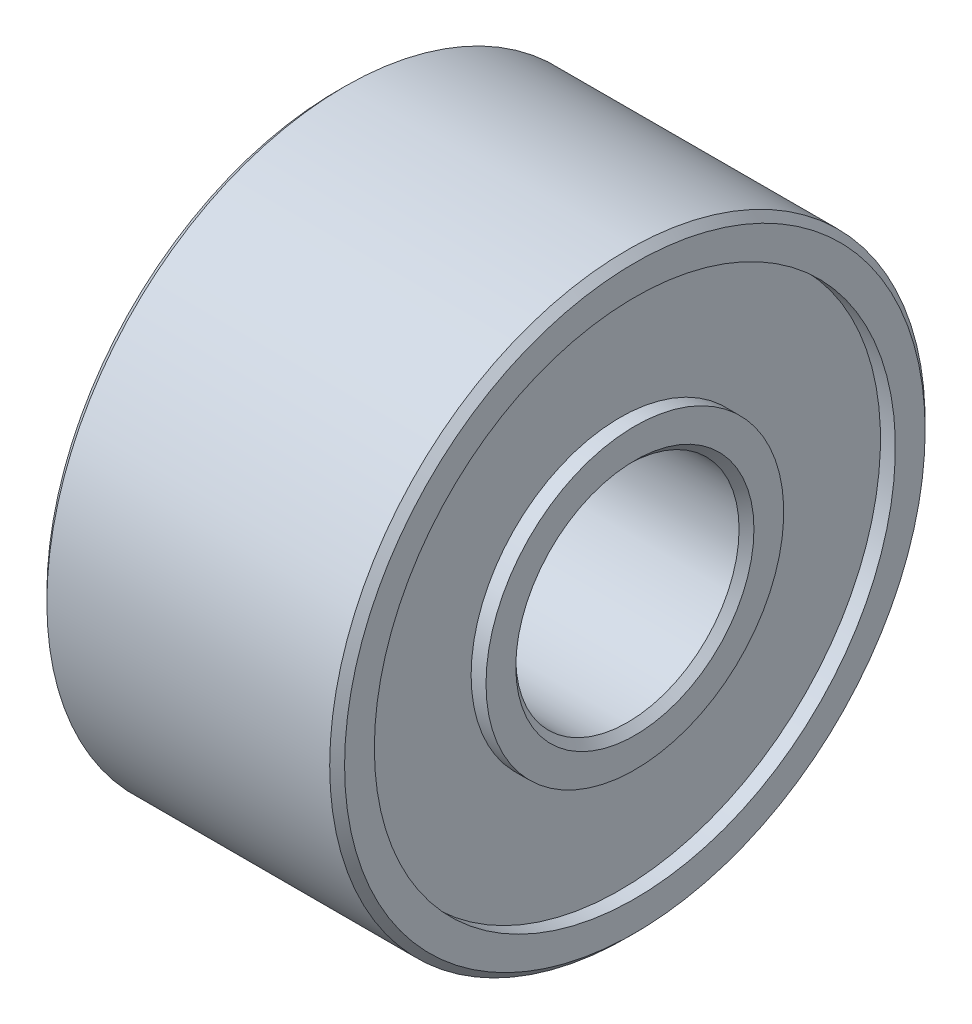
ISO-10303-21;
HEADER;
FILE_DESCRIPTION(('STEP AP214'),'2;1');
FILE_NAME('part.step','',(''),(''),'','','');
FILE_SCHEMA(('AUTOMOTIVE_DESIGN { 1 0 10303 214 1 1 1 1 }'));
ENDSEC;
DATA;
#1=APPLICATION_CONTEXT('core data for automotive mechanical design processes');
#2=APPLICATION_PROTOCOL_DEFINITION('international standard','automotive_design',2000,#1);
#3=PRODUCT_CONTEXT('',#1,'mechanical');
#4=PRODUCT('Part','Part','',(#3));
#5=PRODUCT_RELATED_PRODUCT_CATEGORY('part','',(#4));
#6=PRODUCT_DEFINITION_FORMATION('','',#4);
#7=PRODUCT_DEFINITION_CONTEXT('part definition',#1,'design');
#8=PRODUCT_DEFINITION('design','',#6,#7);
#9=PRODUCT_DEFINITION_SHAPE('','',#8);
#10=(LENGTH_UNIT() NAMED_UNIT(*) SI_UNIT(.MILLI.,.METRE.));
#11=(NAMED_UNIT(*) PLANE_ANGLE_UNIT() SI_UNIT($,.RADIAN.));
#12=(NAMED_UNIT(*) SI_UNIT($,.STERADIAN.) SOLID_ANGLE_UNIT());
#13=UNCERTAINTY_MEASURE_WITH_UNIT(LENGTH_MEASURE(1.E-05),#10,'distance_accuracy_value','');
#14=(GEOMETRIC_REPRESENTATION_CONTEXT(3) GLOBAL_UNCERTAINTY_ASSIGNED_CONTEXT((#13)) GLOBAL_UNIT_ASSIGNED_CONTEXT((#10,
#11,#12)) REPRESENTATION_CONTEXT('',''));
#15=CARTESIAN_POINT('',(0.,0.,0.));
#16=DIRECTION('',(0.,0.,1.));
#17=DIRECTION('',(1.,0.,0.));
#18=AXIS2_PLACEMENT_3D('',#15,#16,#17);
#19=CARTESIAN_POINT('',(-16.4448673667726,0.,0.));
#20=DIRECTION('',(-1.,0.,0.));
#21=DIRECTION('',(0.,0.,1.));
#22=AXIS2_PLACEMENT_3D('',#19,#20,#21);
#23=CYLINDRICAL_SURFACE('',#22,1.5);
#24=CARTESIAN_POINT('',(-3.9,0.,0.));
#25=DIRECTION('',(1.,0.,0.));
#26=DIRECTION('',(0.,0.,-1.));
#27=AXIS2_PLACEMENT_3D('',#24,#25,#26);
#28=CIRCLE('',#27,1.5);
#29=CARTESIAN_POINT('',(-3.9,0.,-1.5));
#30=VERTEX_POINT('',#29);
#31=EDGE_CURVE('E58',#30,#30,#28,.F.);
#32=ORIENTED_EDGE('',*,*,#31,.T.);
#33=EDGE_LOOP('',(#32));
#34=FACE_BOUND('',#33,.T.);
#35=CARTESIAN_POINT('',(-0.0999999999999994,0.,0.));
#36=DIRECTION('',(-1.,0.,0.));
#37=DIRECTION('',(0.,0.,1.));
#38=AXIS2_PLACEMENT_3D('',#35,#36,#37);
#39=CIRCLE('',#38,1.5);
#40=CARTESIAN_POINT('',(-0.0999999999999994,0.,1.5));
#41=VERTEX_POINT('',#40);
#42=EDGE_CURVE('E61',#41,#41,#39,.F.);
#43=ORIENTED_EDGE('',*,*,#42,.T.);
#44=EDGE_LOOP('',(#43));
#45=FACE_BOUND('',#44,.T.);
#46=ADVANCED_FACE('F32',(#34,#45),#23,.F.);
#47=CARTESIAN_POINT('',(0.,1.5,0.));
#48=DIRECTION('',(-1.,0.,0.));
#49=DIRECTION('',(0.,0.,1.));
#50=AXIS2_PLACEMENT_3D('',#47,#48,#49);
#51=PLANE('',#50);
#52=CARTESIAN_POINT('',(0.,0.,0.));
#53=DIRECTION('',(-1.,0.,0.));
#54=DIRECTION('',(0.,0.,1.));
#55=AXIS2_PLACEMENT_3D('',#52,#53,#54);
#56=CIRCLE('',#55,1.6);
#57=CARTESIAN_POINT('',(0.,0.,1.6));
#58=VERTEX_POINT('',#57);
#59=EDGE_CURVE('E52',#58,#58,#56,.T.);
#60=ORIENTED_EDGE('',*,*,#59,.T.);
#61=EDGE_LOOP('',(#60));
#62=FACE_BOUND('',#61,.T.);
#63=CARTESIAN_POINT('',(0.,0.,0.));
#64=DIRECTION('',(-1.,0.,0.));
#65=DIRECTION('',(0.,0.,1.));
#66=AXIS2_PLACEMENT_3D('',#63,#64,#65);
#67=CIRCLE('',#66,2.);
#68=CARTESIAN_POINT('',(0.,0.,2.));
#69=VERTEX_POINT('',#68);
#70=EDGE_CURVE('E64',#69,#69,#67,.T.);
#71=ORIENTED_EDGE('',*,*,#70,.F.);
#72=EDGE_LOOP('',(#71));
#73=FACE_BOUND('',#72,.T.);
#74=ADVANCED_FACE('F120',(#62,#73),#51,.F.);
#75=CARTESIAN_POINT('',(-16.4448673667726,0.,0.));
#76=DIRECTION('',(-1.,0.,0.));
#77=DIRECTION('',(0.,0.,1.));
#78=AXIS2_PLACEMENT_3D('',#75,#76,#77);
#79=CYLINDRICAL_SURFACE('',#78,2.);
#80=CARTESIAN_POINT('',(-0.199999999999999,0.,0.));
#81=DIRECTION('',(-1.,0.,0.));
#82=DIRECTION('',(0.,0.,1.));
#83=AXIS2_PLACEMENT_3D('',#80,#81,#82);
#84=CIRCLE('',#83,2.);
#85=CARTESIAN_POINT('',(-0.199999999999999,0.,2.));
#86=VERTEX_POINT('',#85);
#87=EDGE_CURVE('E67',#86,#86,#84,.T.);
#88=ORIENTED_EDGE('',*,*,#87,.F.);
#89=EDGE_LOOP('',(#88));
#90=FACE_BOUND('',#89,.T.);
#91=ORIENTED_EDGE('',*,*,#70,.T.);
#92=EDGE_LOOP('',(#91));
#93=FACE_BOUND('',#92,.T.);
#94=ADVANCED_FACE('F126',(#90,#93),#79,.T.);
#95=CARTESIAN_POINT('',(-0.199999999999999,3.5,0.));
#96=DIRECTION('',(-1.,0.,0.));
#97=DIRECTION('',(0.,0.,1.));
#98=AXIS2_PLACEMENT_3D('',#95,#96,#97);
#99=PLANE('',#98);
#100=CARTESIAN_POINT('',(-0.199999999999999,0.,0.));
#101=DIRECTION('',(-1.,0.,0.));
#102=DIRECTION('',(0.,0.,1.));
#103=AXIS2_PLACEMENT_3D('',#100,#101,#102);
#104=CIRCLE('',#103,3.5);
#105=CARTESIAN_POINT('',(-0.199999999999999,0.,3.5));
#106=VERTEX_POINT('',#105);
#107=EDGE_CURVE('E70',#106,#106,#104,.T.);
#108=ORIENTED_EDGE('',*,*,#107,.F.);
#109=EDGE_LOOP('',(#108));
#110=FACE_BOUND('',#109,.T.);
#111=ORIENTED_EDGE('',*,*,#87,.T.);
#112=EDGE_LOOP('',(#111));
#113=FACE_BOUND('',#112,.T.);
#114=ADVANCED_FACE('F236',(#110,#113),#99,.F.);
#115=CARTESIAN_POINT('',(-16.4448673667726,0.,0.));
#116=DIRECTION('',(-1.,0.,0.));
#117=DIRECTION('',(0.,0.,1.));
#118=AXIS2_PLACEMENT_3D('',#115,#116,#117);
#119=CYLINDRICAL_SURFACE('',#118,3.5);
#120=CARTESIAN_POINT('',(0.,0.,0.));
#121=DIRECTION('',(-1.,0.,0.));
#122=DIRECTION('',(0.,0.,1.));
#123=AXIS2_PLACEMENT_3D('',#120,#121,#122);
#124=CIRCLE('',#123,3.5);
#125=CARTESIAN_POINT('',(0.,0.,3.5));
#126=VERTEX_POINT('',#125);
#127=EDGE_CURVE('E73',#126,#126,#124,.T.);
#128=ORIENTED_EDGE('',*,*,#127,.F.);
#129=EDGE_LOOP('',(#128));
#130=FACE_BOUND('',#129,.T.);
#131=ORIENTED_EDGE('',*,*,#107,.T.);
#132=EDGE_LOOP('',(#131));
#133=FACE_BOUND('',#132,.T.);
#134=ADVANCED_FACE('F199',(#130,#133),#119,.F.);
#135=CARTESIAN_POINT('',(0.,3.5,0.));
#136=DIRECTION('',(-1.,0.,0.));
#137=DIRECTION('',(0.,0.,1.));
#138=AXIS2_PLACEMENT_3D('',#135,#136,#137);
#139=PLANE('',#138);
#140=CARTESIAN_POINT('',(0.,0.,0.));
#141=DIRECTION('',(-1.,0.,0.));
#142=DIRECTION('',(0.,0.,1.));
#143=AXIS2_PLACEMENT_3D('',#140,#141,#142);
#144=CIRCLE('',#143,3.9);
#145=CARTESIAN_POINT('',(0.,0.,3.9));
#146=VERTEX_POINT('',#145);
#147=EDGE_CURVE('E10',#146,#146,#144,.F.);
#148=ORIENTED_EDGE('',*,*,#147,.T.);
#149=EDGE_LOOP('',(#148));
#150=FACE_BOUND('',#149,.T.);
#151=ORIENTED_EDGE('',*,*,#127,.T.);
#152=EDGE_LOOP('',(#151));
#153=FACE_BOUND('',#152,.T.);
#154=ADVANCED_FACE('F117',(#150,#153),#139,.F.);
#155=CARTESIAN_POINT('',(-16.4448673667726,0.,0.));
#156=DIRECTION('',(-1.,0.,0.));
#157=DIRECTION('',(0.,0.,1.));
#158=AXIS2_PLACEMENT_3D('',#155,#156,#157);
#159=CYLINDRICAL_SURFACE('',#158,4.);
#160=CARTESIAN_POINT('',(-3.9,0.,0.));
#161=DIRECTION('',(1.,0.,0.));
#162=DIRECTION('',(0.,0.,-1.));
#163=AXIS2_PLACEMENT_3D('',#160,#161,#162);
#164=CIRCLE('',#163,4.);
#165=CARTESIAN_POINT('',(-3.9,0.,-4.));
#166=VERTEX_POINT('',#165);
#167=EDGE_CURVE('E39',#166,#166,#164,.T.);
#168=ORIENTED_EDGE('',*,*,#167,.T.);
#169=EDGE_LOOP('',(#168));
#170=FACE_BOUND('',#169,.T.);
#171=CARTESIAN_POINT('',(-0.0999999999999994,0.,0.));
#172=DIRECTION('',(-1.,0.,0.));
#173=DIRECTION('',(0.,0.,1.));
#174=AXIS2_PLACEMENT_3D('',#171,#172,#173);
#175=CIRCLE('',#174,4.);
#176=CARTESIAN_POINT('',(-0.0999999999999994,0.,4.));
#177=VERTEX_POINT('',#176);
#178=EDGE_CURVE('E43',#177,#177,#175,.T.);
#179=ORIENTED_EDGE('',*,*,#178,.T.);
#180=EDGE_LOOP('',(#179));
#181=FACE_BOUND('',#180,.T.);
#182=ADVANCED_FACE('F111',(#170,#181),#159,.T.);
#183=CARTESIAN_POINT('',(-4.,4.,0.));
#184=DIRECTION('',(1.,0.,0.));
#185=DIRECTION('',(0.,0.,-1.));
#186=AXIS2_PLACEMENT_3D('',#183,#184,#185);
#187=PLANE('',#186);
#188=CARTESIAN_POINT('',(-4.,0.,0.));
#189=DIRECTION('',(1.,0.,0.));
#190=DIRECTION('',(0.,0.,-1.));
#191=AXIS2_PLACEMENT_3D('',#188,#189,#190);
#192=CIRCLE('',#191,3.90000000000001);
#193=CARTESIAN_POINT('',(-4.,0.,-3.90000000000001));
#194=VERTEX_POINT('',#193);
#195=EDGE_CURVE('E47',#194,#194,#192,.F.);
#196=ORIENTED_EDGE('',*,*,#195,.T.);
#197=EDGE_LOOP('',(#196));
#198=FACE_BOUND('',#197,.T.);
#199=CARTESIAN_POINT('',(-4.,0.,0.));
#200=DIRECTION('',(-1.,0.,0.));
#201=DIRECTION('',(0.,0.,1.));
#202=AXIS2_PLACEMENT_3D('',#199,#200,#201);
#203=CIRCLE('',#202,3.5);
#204=CARTESIAN_POINT('',(-4.,0.,3.5));
#205=VERTEX_POINT('',#204);
#206=EDGE_CURVE('E76',#205,#205,#203,.T.);
#207=ORIENTED_EDGE('',*,*,#206,.F.);
#208=EDGE_LOOP('',(#207));
#209=FACE_BOUND('',#208,.T.);
#210=ADVANCED_FACE('F106',(#198,#209),#187,.F.);
#211=CARTESIAN_POINT('',(-16.4448673667726,0.,0.));
#212=DIRECTION('',(-1.,0.,0.));
#213=DIRECTION('',(0.,0.,1.));
#214=AXIS2_PLACEMENT_3D('',#211,#212,#213);
#215=CYLINDRICAL_SURFACE('',#214,3.5);
#216=CARTESIAN_POINT('',(-3.8,0.,0.));
#217=DIRECTION('',(-1.,0.,0.));
#218=DIRECTION('',(0.,0.,1.));
#219=AXIS2_PLACEMENT_3D('',#216,#217,#218);
#220=CIRCLE('',#219,3.5);
#221=CARTESIAN_POINT('',(-3.8,0.,3.5));
#222=VERTEX_POINT('',#221);
#223=EDGE_CURVE('E79',#222,#222,#220,.T.);
#224=ORIENTED_EDGE('',*,*,#223,.F.);
#225=EDGE_LOOP('',(#224));
#226=FACE_BOUND('',#225,.T.);
#227=ORIENTED_EDGE('',*,*,#206,.T.);
#228=EDGE_LOOP('',(#227));
#229=FACE_BOUND('',#228,.T.);
#230=ADVANCED_FACE('F100',(#226,#229),#215,.F.);
#231=CARTESIAN_POINT('',(-3.8,3.5,0.));
#232=DIRECTION('',(1.,0.,0.));
#233=DIRECTION('',(0.,0.,-1.));
#234=AXIS2_PLACEMENT_3D('',#231,#232,#233);
#235=PLANE('',#234);
#236=CARTESIAN_POINT('',(-3.8,0.,0.));
#237=DIRECTION('',(-1.,0.,0.));
#238=DIRECTION('',(0.,0.,1.));
#239=AXIS2_PLACEMENT_3D('',#236,#237,#238);
#240=CIRCLE('',#239,2.);
#241=CARTESIAN_POINT('',(-3.8,0.,2.));
#242=VERTEX_POINT('',#241);
#243=EDGE_CURVE('E82',#242,#242,#240,.T.);
#244=ORIENTED_EDGE('',*,*,#243,.F.);
#245=EDGE_LOOP('',(#244));
#246=FACE_BOUND('',#245,.T.);
#247=ORIENTED_EDGE('',*,*,#223,.T.);
#248=EDGE_LOOP('',(#247));
#249=FACE_BOUND('',#248,.T.);
#250=ADVANCED_FACE('F94',(#246,#249),#235,.F.);
#251=CARTESIAN_POINT('',(-16.4448673667726,0.,0.));
#252=DIRECTION('',(-1.,0.,0.));
#253=DIRECTION('',(0.,0.,1.));
#254=AXIS2_PLACEMENT_3D('',#251,#252,#253);
#255=CYLINDRICAL_SURFACE('',#254,2.);
#256=CARTESIAN_POINT('',(-4.,0.,0.));
#257=DIRECTION('',(-1.,0.,0.));
#258=DIRECTION('',(0.,0.,1.));
#259=AXIS2_PLACEMENT_3D('',#256,#257,#258);
#260=CIRCLE('',#259,2.);
#261=CARTESIAN_POINT('',(-4.,0.,2.));
#262=VERTEX_POINT('',#261);
#263=EDGE_CURVE('E85',#262,#262,#260,.T.);
#264=ORIENTED_EDGE('',*,*,#263,.F.);
#265=EDGE_LOOP('',(#264));
#266=FACE_BOUND('',#265,.T.);
#267=ORIENTED_EDGE('',*,*,#243,.T.);
#268=EDGE_LOOP('',(#267));
#269=FACE_BOUND('',#268,.T.);
#270=ADVANCED_FACE('F91',(#266,#269),#255,.T.);
#271=CARTESIAN_POINT('',(-4.,2.,0.));
#272=DIRECTION('',(1.,0.,0.));
#273=DIRECTION('',(0.,0.,-1.));
#274=AXIS2_PLACEMENT_3D('',#271,#272,#273);
#275=PLANE('',#274);
#276=CARTESIAN_POINT('',(-4.,0.,0.));
#277=DIRECTION('',(1.,0.,0.));
#278=DIRECTION('',(0.,0.,-1.));
#279=AXIS2_PLACEMENT_3D('',#276,#277,#278);
#280=CIRCLE('',#279,1.6);
#281=CARTESIAN_POINT('',(-4.,0.,-1.6));
#282=VERTEX_POINT('',#281);
#283=EDGE_CURVE('E55',#282,#282,#280,.T.);
#284=ORIENTED_EDGE('',*,*,#283,.T.);
#285=EDGE_LOOP('',(#284));
#286=FACE_BOUND('',#285,.T.);
#287=ORIENTED_EDGE('',*,*,#263,.T.);
#288=EDGE_LOOP('',(#287));
#289=FACE_BOUND('',#288,.T.);
#290=ADVANCED_FACE('F89',(#286,#289),#275,.F.);
#291=CARTESIAN_POINT('',(-3.9,0.,0.));
#292=DIRECTION('',(-1.,0.,0.));
#293=DIRECTION('',(0.,0.,1.));
#294=AXIS2_PLACEMENT_3D('',#291,#292,#293);
#295=CONICAL_SURFACE('',#294,1.5,0.785398163397445);
#296=ORIENTED_EDGE('',*,*,#283,.F.);
#297=EDGE_LOOP('',(#296));
#298=FACE_BOUND('',#297,.T.);
#299=ORIENTED_EDGE('',*,*,#31,.F.);
#300=EDGE_LOOP('',(#299));
#301=FACE_BOUND('',#300,.T.);
#302=ADVANCED_FACE('F132',(#298,#301),#295,.F.);
#303=CARTESIAN_POINT('',(0.,0.,0.));
#304=DIRECTION('',(1.,0.,0.));
#305=DIRECTION('',(0.,0.,-1.));
#306=AXIS2_PLACEMENT_3D('',#303,#304,#305);
#307=CONICAL_SURFACE('',#306,1.6,0.78539816339745);
#308=ORIENTED_EDGE('',*,*,#42,.F.);
#309=EDGE_LOOP('',(#308));
#310=FACE_BOUND('',#309,.T.);
#311=ORIENTED_EDGE('',*,*,#59,.F.);
#312=EDGE_LOOP('',(#311));
#313=FACE_BOUND('',#312,.T.);
#314=ADVANCED_FACE('F135',(#310,#313),#307,.F.);
#315=CARTESIAN_POINT('',(-4.,0.,0.));
#316=DIRECTION('',(1.,0.,0.));
#317=DIRECTION('',(0.,0.,-1.));
#318=AXIS2_PLACEMENT_3D('',#315,#316,#317);
#319=CONICAL_SURFACE('',#318,3.90000000000001,0.78539816339744);
#320=ORIENTED_EDGE('',*,*,#167,.F.);
#321=EDGE_LOOP('',(#320));
#322=FACE_BOUND('',#321,.T.);
#323=ORIENTED_EDGE('',*,*,#195,.F.);
#324=EDGE_LOOP('',(#323));
#325=FACE_BOUND('',#324,.T.);
#326=ADVANCED_FACE('F138',(#322,#325),#319,.T.);
#327=CARTESIAN_POINT('',(-0.0999999999999994,0.,0.));
#328=DIRECTION('',(-1.,0.,0.));
#329=DIRECTION('',(0.,0.,1.));
#330=AXIS2_PLACEMENT_3D('',#327,#328,#329);
#331=CONICAL_SURFACE('',#330,4.,0.785398163397457);
#332=ORIENTED_EDGE('',*,*,#147,.F.);
#333=EDGE_LOOP('',(#332));
#334=FACE_BOUND('',#333,.T.);
#335=ORIENTED_EDGE('',*,*,#178,.F.);
#336=EDGE_LOOP('',(#335));
#337=FACE_BOUND('',#336,.T.);
#338=ADVANCED_FACE('F34',(#334,#337),#331,.T.);
#339=CLOSED_SHELL('',(#46,#74,#94,#114,#134,#154,#182,#210,#230,#250,#270,#290,#302,#314,#326,#338));
#340=MANIFOLD_SOLID_BREP('B2',#339);
#341=ADVANCED_BREP_SHAPE_REPRESENTATION('',(#18,#340),#14);
#342=SHAPE_DEFINITION_REPRESENTATION(#9,#341);
ENDSEC;
END-ISO-10303-21;
